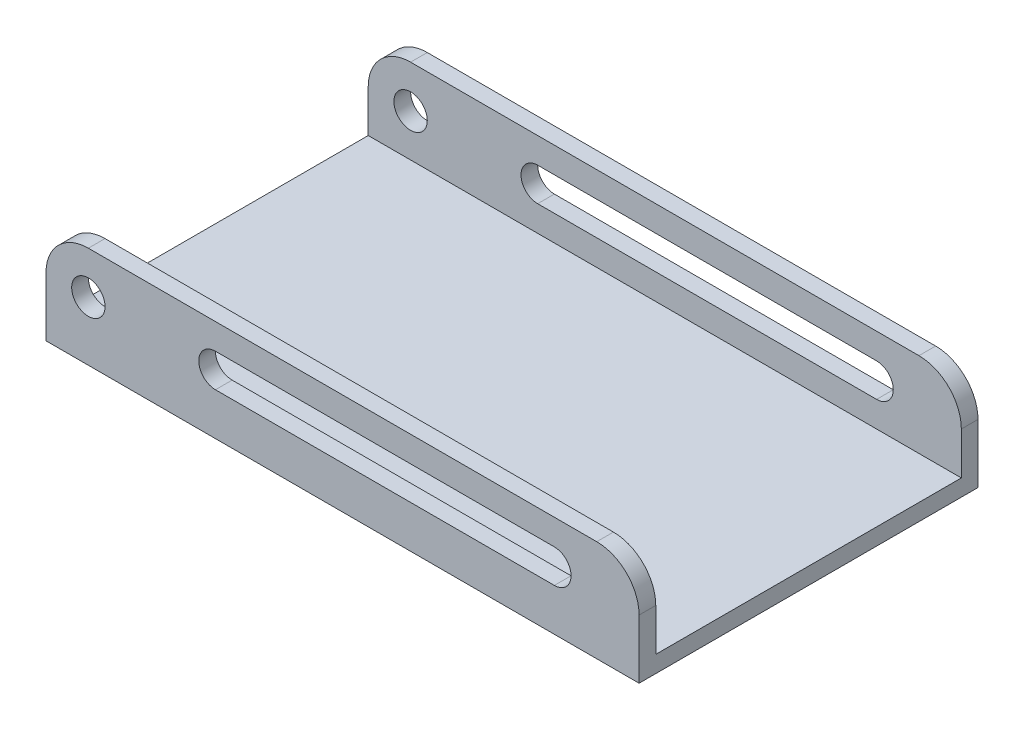
ISO-10303-21;
HEADER;
FILE_DESCRIPTION(('STEP AP214'),'2;1');
FILE_NAME('part.step','',(''),(''),'','','');
FILE_SCHEMA(('AUTOMOTIVE_DESIGN { 1 0 10303 214 1 1 1 1 }'));
ENDSEC;
DATA;
#1=APPLICATION_CONTEXT('core data for automotive mechanical design processes');
#2=APPLICATION_PROTOCOL_DEFINITION('international standard','automotive_design',2000,#1);
#3=PRODUCT_CONTEXT('',#1,'mechanical');
#4=PRODUCT('Part','Part','',(#3));
#5=PRODUCT_RELATED_PRODUCT_CATEGORY('part','',(#4));
#6=PRODUCT_DEFINITION_FORMATION('','',#4);
#7=PRODUCT_DEFINITION_CONTEXT('part definition',#1,'design');
#8=PRODUCT_DEFINITION('design','',#6,#7);
#9=PRODUCT_DEFINITION_SHAPE('','',#8);
#10=(LENGTH_UNIT() NAMED_UNIT(*) SI_UNIT(.MILLI.,.METRE.));
#11=(NAMED_UNIT(*) PLANE_ANGLE_UNIT() SI_UNIT($,.RADIAN.));
#12=(NAMED_UNIT(*) SI_UNIT($,.STERADIAN.) SOLID_ANGLE_UNIT());
#13=UNCERTAINTY_MEASURE_WITH_UNIT(LENGTH_MEASURE(1.E-05),#10,'distance_accuracy_value','');
#14=(GEOMETRIC_REPRESENTATION_CONTEXT(3) GLOBAL_UNCERTAINTY_ASSIGNED_CONTEXT((#13)) GLOBAL_UNIT_ASSIGNED_CONTEXT((#10,
#11,#12)) REPRESENTATION_CONTEXT('',''));
#15=CARTESIAN_POINT('',(0.,0.,0.));
#16=DIRECTION('',(0.,0.,1.));
#17=DIRECTION('',(1.,0.,0.));
#18=AXIS2_PLACEMENT_3D('',#15,#16,#17);
#19=CARTESIAN_POINT('',(0.,5.,0.));
#20=DIRECTION('',(0.,-1.,0.));
#21=DIRECTION('',(0.,0.,-1.));
#22=AXIS2_PLACEMENT_3D('',#19,#20,#21);
#23=PLANE('',#22);
#24=DIRECTION('',(1.,0.,0.));
#25=VECTOR('',#24,1.);
#26=CARTESIAN_POINT('',(0.,5.,-96.6));
#27=LINE('',#26,#25);
#28=CARTESIAN_POINT('',(0.,5.,-96.6));
#29=VERTEX_POINT('',#28);
#30=CARTESIAN_POINT('',(177.8,5.,-96.6));
#31=VERTEX_POINT('',#30);
#32=EDGE_CURVE('E245',#29,#31,#27,.T.);
#33=ORIENTED_EDGE('',*,*,#32,.F.);
#34=DIRECTION('',(0.,0.,1.));
#35=VECTOR('',#34,1.);
#36=CARTESIAN_POINT('',(0.,5.,0.));
#37=LINE('',#36,#35);
#38=CARTESIAN_POINT('',(0.,5.,-5.));
#39=VERTEX_POINT('',#38);
#40=EDGE_CURVE('E272',#29,#39,#37,.T.);
#41=ORIENTED_EDGE('',*,*,#40,.T.);
#42=DIRECTION('',(-1.,0.,0.));
#43=VECTOR('',#42,1.);
#44=CARTESIAN_POINT('',(0.,5.,-5.));
#45=LINE('',#44,#43);
#46=CARTESIAN_POINT('',(177.8,5.,-5.));
#47=VERTEX_POINT('',#46);
#48=EDGE_CURVE('E258',#47,#39,#45,.T.);
#49=ORIENTED_EDGE('',*,*,#48,.F.);
#50=DIRECTION('',(0.,0.,-1.));
#51=VECTOR('',#50,1.);
#52=CARTESIAN_POINT('',(177.8,5.,0.));
#53=LINE('',#52,#51);
#54=EDGE_CURVE('E275',#47,#31,#53,.T.);
#55=ORIENTED_EDGE('',*,*,#54,.T.);
#56=EDGE_LOOP('',(#33,#41,#49,#55));
#57=FACE_BOUND('',#56,.T.);
#58=ADVANCED_FACE('F37',(#57),#23,.F.);
#59=CARTESIAN_POINT('',(0.,5.,0.));
#60=DIRECTION('',(1.,0.,0.));
#61=DIRECTION('',(0.,0.,-1.));
#62=AXIS2_PLACEMENT_3D('',#59,#60,#61);
#63=PLANE('',#62);
#64=DIRECTION('',(0.,-1.,0.));
#65=VECTOR('',#64,1.);
#66=CARTESIAN_POINT('',(0.,30.4,-96.6));
#67=LINE('',#66,#65);
#68=CARTESIAN_POINT('',(0.,17.7,-96.6));
#69=VERTEX_POINT('',#68);
#70=EDGE_CURVE('E256',#69,#29,#67,.T.);
#71=ORIENTED_EDGE('',*,*,#70,.F.);
#72=DIRECTION('',(0.,0.,1.));
#73=VECTOR('',#72,1.);
#74=CARTESIAN_POINT('',(0.,17.7,-101.6));
#75=LINE('',#74,#73);
#76=CARTESIAN_POINT('',(0.,17.7,-101.6));
#77=VERTEX_POINT('',#76);
#78=EDGE_CURVE('E320',#69,#77,#75,.F.);
#79=ORIENTED_EDGE('',*,*,#78,.T.);
#80=DIRECTION('',(0.,-1.,0.));
#81=VECTOR('',#80,1.);
#82=CARTESIAN_POINT('',(0.,5.,-101.6));
#83=LINE('',#82,#81);
#84=CARTESIAN_POINT('',(0.,0.,-101.6));
#85=VERTEX_POINT('',#84);
#86=EDGE_CURVE('E279',#77,#85,#83,.T.);
#87=ORIENTED_EDGE('',*,*,#86,.T.);
#88=DIRECTION('',(0.,0.,1.));
#89=VECTOR('',#88,1.);
#90=CARTESIAN_POINT('',(0.,0.,0.));
#91=LINE('',#90,#89);
#92=CARTESIAN_POINT('',(0.,0.,0.));
#93=VERTEX_POINT('',#92);
#94=EDGE_CURVE('E271',#85,#93,#91,.T.);
#95=ORIENTED_EDGE('',*,*,#94,.T.);
#96=DIRECTION('',(0.,-1.,0.));
#97=VECTOR('',#96,1.);
#98=CARTESIAN_POINT('',(0.,5.,0.));
#99=LINE('',#98,#97);
#100=CARTESIAN_POINT('',(0.,17.7,0.));
#101=VERTEX_POINT('',#100);
#102=EDGE_CURVE('E295',#101,#93,#99,.T.);
#103=ORIENTED_EDGE('',*,*,#102,.F.);
#104=DIRECTION('',(0.,0.,1.));
#105=VECTOR('',#104,1.);
#106=CARTESIAN_POINT('',(0.,17.7,0.));
#107=LINE('',#106,#105);
#108=CARTESIAN_POINT('',(0.,17.7,-5.));
#109=VERTEX_POINT('',#108);
#110=EDGE_CURVE('E318',#101,#109,#107,.F.);
#111=ORIENTED_EDGE('',*,*,#110,.T.);
#112=DIRECTION('',(0.,-1.,0.));
#113=VECTOR('',#112,1.);
#114=CARTESIAN_POINT('',(0.,30.4,-5.));
#115=LINE('',#114,#113);
#116=EDGE_CURVE('E265',#109,#39,#115,.T.);
#117=ORIENTED_EDGE('',*,*,#116,.T.);
#118=ORIENTED_EDGE('',*,*,#40,.F.);
#119=EDGE_LOOP('',(#71,#79,#87,#95,#103,#111,#117,#118));
#120=FACE_BOUND('',#119,.T.);
#121=ADVANCED_FACE('F355',(#120),#63,.F.);
#122=CARTESIAN_POINT('',(0.,5.,0.));
#123=DIRECTION('',(0.,0.,-1.));
#124=DIRECTION('',(-1.,0.,0.));
#125=AXIS2_PLACEMENT_3D('',#122,#123,#124);
#126=PLANE('',#125);
#127=DIRECTION('',(1.,0.,0.));
#128=VECTOR('',#127,1.);
#129=CARTESIAN_POINT('',(50.8,12.7,0.));
#130=LINE('',#129,#128);
#131=CARTESIAN_POINT('',(50.8,12.7,0.));
#132=VERTEX_POINT('',#131);
#133=CARTESIAN_POINT('',(152.4,12.7,0.));
#134=VERTEX_POINT('',#133);
#135=EDGE_CURVE('E210',#132,#134,#130,.T.);
#136=ORIENTED_EDGE('',*,*,#135,.F.);
#137=CARTESIAN_POINT('',(50.8,17.7,0.));
#138=DIRECTION('',(0.,0.,1.));
#139=DIRECTION('',(1.,0.,0.));
#140=AXIS2_PLACEMENT_3D('',#137,#138,#139);
#141=CIRCLE('',#140,5.);
#142=CARTESIAN_POINT('',(50.8,22.7,0.));
#143=VERTEX_POINT('',#142);
#144=EDGE_CURVE('E208',#143,#132,#141,.T.);
#145=ORIENTED_EDGE('',*,*,#144,.F.);
#146=DIRECTION('',(-1.,0.,0.));
#147=VECTOR('',#146,1.);
#148=CARTESIAN_POINT('',(50.8,22.7,0.));
#149=LINE('',#148,#147);
#150=CARTESIAN_POINT('',(152.4,22.7,0.));
#151=VERTEX_POINT('',#150);
#152=EDGE_CURVE('E200',#151,#143,#149,.T.);
#153=ORIENTED_EDGE('',*,*,#152,.F.);
#154=CARTESIAN_POINT('',(152.4,17.7,0.));
#155=DIRECTION('',(0.,0.,1.));
#156=DIRECTION('',(1.,0.,0.));
#157=AXIS2_PLACEMENT_3D('',#154,#155,#156);
#158=CIRCLE('',#157,5.);
#159=EDGE_CURVE('E203',#134,#151,#158,.T.);
#160=ORIENTED_EDGE('',*,*,#159,.F.);
#161=EDGE_LOOP('',(#136,#145,#153,#160));
#162=FACE_BOUND('',#161,.T.);
#163=CARTESIAN_POINT('',(12.7,17.7,0.));
#164=DIRECTION('',(0.,0.,1.));
#165=DIRECTION('',(1.,0.,0.));
#166=AXIS2_PLACEMENT_3D('',#163,#164,#165);
#167=CIRCLE('',#166,5.);
#168=CARTESIAN_POINT('',(17.7,17.7,0.));
#169=VERTEX_POINT('',#168);
#170=EDGE_CURVE('E227',#169,#169,#167,.T.);
#171=ORIENTED_EDGE('',*,*,#170,.F.);
#172=EDGE_LOOP('',(#171));
#173=FACE_BOUND('',#172,.T.);
#174=DIRECTION('',(1.,0.,0.));
#175=VECTOR('',#174,1.);
#176=CARTESIAN_POINT('',(0.,30.4,0.));
#177=LINE('',#176,#175);
#178=CARTESIAN_POINT('',(12.7,30.4,0.));
#179=VERTEX_POINT('',#178);
#180=CARTESIAN_POINT('',(165.1,30.4,0.));
#181=VERTEX_POINT('',#180);
#182=EDGE_CURVE('E259',#179,#181,#177,.T.);
#183=ORIENTED_EDGE('',*,*,#182,.F.);
#184=CARTESIAN_POINT('',(12.7,17.7,0.));
#185=DIRECTION('',(0.,0.,-1.));
#186=DIRECTION('',(-1.,0.,0.));
#187=AXIS2_PLACEMENT_3D('',#184,#185,#186);
#188=CIRCLE('',#187,12.7);
#189=EDGE_CURVE('E334',#179,#101,#188,.F.);
#190=ORIENTED_EDGE('',*,*,#189,.T.);
#191=ORIENTED_EDGE('',*,*,#102,.T.);
#192=DIRECTION('',(1.,0.,0.));
#193=VECTOR('',#192,1.);
#194=CARTESIAN_POINT('',(0.,0.,0.));
#195=LINE('',#194,#193);
#196=CARTESIAN_POINT('',(177.8,0.,0.));
#197=VERTEX_POINT('',#196);
#198=EDGE_CURVE('E282',#93,#197,#195,.T.);
#199=ORIENTED_EDGE('',*,*,#198,.T.);
#200=DIRECTION('',(0.,-1.,0.));
#201=VECTOR('',#200,1.);
#202=CARTESIAN_POINT('',(177.8,5.,0.));
#203=LINE('',#202,#201);
#204=CARTESIAN_POINT('',(177.8,17.7,0.));
#205=VERTEX_POINT('',#204);
#206=EDGE_CURVE('E293',#205,#197,#203,.T.);
#207=ORIENTED_EDGE('',*,*,#206,.F.);
#208=CARTESIAN_POINT('',(165.1,17.7,0.));
#209=DIRECTION('',(0.,0.,-1.));
#210=DIRECTION('',(-1.,0.,0.));
#211=AXIS2_PLACEMENT_3D('',#208,#209,#210);
#212=CIRCLE('',#211,12.7);
#213=EDGE_CURVE('E332',#205,#181,#212,.F.);
#214=ORIENTED_EDGE('',*,*,#213,.T.);
#215=EDGE_LOOP('',(#183,#190,#191,#199,#207,#214));
#216=FACE_BOUND('',#215,.T.);
#217=ADVANCED_FACE('F351',(#162,#173,#216),#126,.F.);
#218=CARTESIAN_POINT('',(177.8,5.,0.));
#219=DIRECTION('',(-1.,0.,0.));
#220=DIRECTION('',(0.,0.,1.));
#221=AXIS2_PLACEMENT_3D('',#218,#219,#220);
#222=PLANE('',#221);
#223=DIRECTION('',(0.,-1.,0.));
#224=VECTOR('',#223,1.);
#225=CARTESIAN_POINT('',(177.8,5.,-101.6));
#226=LINE('',#225,#224);
#227=CARTESIAN_POINT('',(177.8,17.7,-101.6));
#228=VERTEX_POINT('',#227);
#229=CARTESIAN_POINT('',(177.8,0.,-101.6));
#230=VERTEX_POINT('',#229);
#231=EDGE_CURVE('E291',#228,#230,#226,.T.);
#232=ORIENTED_EDGE('',*,*,#231,.F.);
#233=DIRECTION('',(0.,0.,-1.));
#234=VECTOR('',#233,1.);
#235=CARTESIAN_POINT('',(177.8,17.7,-96.6));
#236=LINE('',#235,#234);
#237=CARTESIAN_POINT('',(177.8,17.7,-96.6));
#238=VERTEX_POINT('',#237);
#239=EDGE_CURVE('E11',#228,#238,#236,.F.);
#240=ORIENTED_EDGE('',*,*,#239,.T.);
#241=DIRECTION('',(0.,-1.,0.));
#242=VECTOR('',#241,1.);
#243=CARTESIAN_POINT('',(177.8,30.4,-96.6));
#244=LINE('',#243,#242);
#245=EDGE_CURVE('E252',#238,#31,#244,.T.);
#246=ORIENTED_EDGE('',*,*,#245,.T.);
#247=ORIENTED_EDGE('',*,*,#54,.F.);
#248=DIRECTION('',(0.,-1.,0.));
#249=VECTOR('',#248,1.);
#250=CARTESIAN_POINT('',(177.8,30.4,-5.));
#251=LINE('',#250,#249);
#252=CARTESIAN_POINT('',(177.8,17.7,-5.));
#253=VERTEX_POINT('',#252);
#254=EDGE_CURVE('E269',#253,#47,#251,.T.);
#255=ORIENTED_EDGE('',*,*,#254,.F.);
#256=DIRECTION('',(0.,0.,-1.));
#257=VECTOR('',#256,1.);
#258=CARTESIAN_POINT('',(177.8,17.7,0.));
#259=LINE('',#258,#257);
#260=EDGE_CURVE('E45',#253,#205,#259,.F.);
#261=ORIENTED_EDGE('',*,*,#260,.T.);
#262=ORIENTED_EDGE('',*,*,#206,.T.);
#263=DIRECTION('',(0.,0.,-1.));
#264=VECTOR('',#263,1.);
#265=CARTESIAN_POINT('',(177.8,0.,0.));
#266=LINE('',#265,#264);
#267=EDGE_CURVE('E285',#197,#230,#266,.T.);
#268=ORIENTED_EDGE('',*,*,#267,.T.);
#269=EDGE_LOOP('',(#232,#240,#246,#247,#255,#261,#262,#268));
#270=FACE_BOUND('',#269,.T.);
#271=ADVANCED_FACE('F385',(#270),#222,.F.);
#272=CARTESIAN_POINT('',(0.,5.,-101.6));
#273=DIRECTION('',(0.,0.,1.));
#274=DIRECTION('',(1.,0.,0.));
#275=AXIS2_PLACEMENT_3D('',#272,#273,#274);
#276=PLANE('',#275);
#277=DIRECTION('',(-1.,0.,0.));
#278=VECTOR('',#277,1.);
#279=CARTESIAN_POINT('',(50.8,22.7,-101.6));
#280=LINE('',#279,#278);
#281=CARTESIAN_POINT('',(152.4,22.7,-101.6));
#282=VERTEX_POINT('',#281);
#283=CARTESIAN_POINT('',(50.8,22.7,-101.6));
#284=VERTEX_POINT('',#283);
#285=EDGE_CURVE('E199',#282,#284,#280,.T.);
#286=ORIENTED_EDGE('',*,*,#285,.T.);
#287=CARTESIAN_POINT('',(50.8,17.7,-101.6));
#288=DIRECTION('',(0.,0.,1.));
#289=DIRECTION('',(1.,0.,0.));
#290=AXIS2_PLACEMENT_3D('',#287,#288,#289);
#291=CIRCLE('',#290,5.);
#292=CARTESIAN_POINT('',(50.8,12.7,-101.6));
#293=VERTEX_POINT('',#292);
#294=EDGE_CURVE('E177',#284,#293,#291,.T.);
#295=ORIENTED_EDGE('',*,*,#294,.T.);
#296=DIRECTION('',(1.,0.,0.));
#297=VECTOR('',#296,1.);
#298=CARTESIAN_POINT('',(50.8,12.7,-101.6));
#299=LINE('',#298,#297);
#300=CARTESIAN_POINT('',(152.4,12.7,-101.6));
#301=VERTEX_POINT('',#300);
#302=EDGE_CURVE('E188',#293,#301,#299,.T.);
#303=ORIENTED_EDGE('',*,*,#302,.T.);
#304=CARTESIAN_POINT('',(152.4,17.7,-101.6));
#305=DIRECTION('',(0.,0.,1.));
#306=DIRECTION('',(1.,0.,0.));
#307=AXIS2_PLACEMENT_3D('',#304,#305,#306);
#308=CIRCLE('',#307,5.);
#309=EDGE_CURVE('E194',#301,#282,#308,.T.);
#310=ORIENTED_EDGE('',*,*,#309,.T.);
#311=EDGE_LOOP('',(#286,#295,#303,#310));
#312=FACE_BOUND('',#311,.T.);
#313=CARTESIAN_POINT('',(12.7,17.7,-101.6));
#314=DIRECTION('',(0.,0.,1.));
#315=DIRECTION('',(1.,0.,0.));
#316=AXIS2_PLACEMENT_3D('',#313,#314,#315);
#317=CIRCLE('',#316,5.);
#318=CARTESIAN_POINT('',(17.7,17.7,-101.6));
#319=VERTEX_POINT('',#318);
#320=EDGE_CURVE('E211',#319,#319,#317,.T.);
#321=ORIENTED_EDGE('',*,*,#320,.T.);
#322=EDGE_LOOP('',(#321));
#323=FACE_BOUND('',#322,.T.);
#324=ORIENTED_EDGE('',*,*,#86,.F.);
#325=CARTESIAN_POINT('',(12.7,17.7,-101.6));
#326=DIRECTION('',(0.,0.,1.));
#327=DIRECTION('',(1.,0.,0.));
#328=AXIS2_PLACEMENT_3D('',#325,#326,#327);
#329=CIRCLE('',#328,12.7);
#330=CARTESIAN_POINT('',(12.7,30.4,-101.6));
#331=VERTEX_POINT('',#330);
#332=EDGE_CURVE('E324',#77,#331,#329,.F.);
#333=ORIENTED_EDGE('',*,*,#332,.T.);
#334=DIRECTION('',(-1.,0.,0.));
#335=VECTOR('',#334,1.);
#336=CARTESIAN_POINT('',(0.,30.4,-101.6));
#337=LINE('',#336,#335);
#338=CARTESIAN_POINT('',(165.1,30.4,-101.6));
#339=VERTEX_POINT('',#338);
#340=EDGE_CURVE('E249',#339,#331,#337,.T.);
#341=ORIENTED_EDGE('',*,*,#340,.F.);
#342=CARTESIAN_POINT('',(165.1,17.7,-101.6));
#343=DIRECTION('',(0.,0.,1.));
#344=DIRECTION('',(1.,0.,0.));
#345=AXIS2_PLACEMENT_3D('',#342,#343,#344);
#346=CIRCLE('',#345,12.7);
#347=EDGE_CURVE('E322',#339,#228,#346,.F.);
#348=ORIENTED_EDGE('',*,*,#347,.T.);
#349=ORIENTED_EDGE('',*,*,#231,.T.);
#350=DIRECTION('',(-1.,0.,0.));
#351=VECTOR('',#350,1.);
#352=CARTESIAN_POINT('',(0.,0.,-101.6));
#353=LINE('',#352,#351);
#354=EDGE_CURVE('E276',#230,#85,#353,.T.);
#355=ORIENTED_EDGE('',*,*,#354,.T.);
#356=EDGE_LOOP('',(#324,#333,#341,#348,#349,#355));
#357=FACE_BOUND('',#356,.T.);
#358=ADVANCED_FACE('F196',(#312,#323,#357),#276,.F.);
#359=CARTESIAN_POINT('',(0.,0.,0.));
#360=DIRECTION('',(0.,-1.,0.));
#361=DIRECTION('',(0.,0.,-1.));
#362=AXIS2_PLACEMENT_3D('',#359,#360,#361);
#363=PLANE('',#362);
#364=ORIENTED_EDGE('',*,*,#94,.F.);
#365=ORIENTED_EDGE('',*,*,#354,.F.);
#366=ORIENTED_EDGE('',*,*,#267,.F.);
#367=ORIENTED_EDGE('',*,*,#198,.F.);
#368=EDGE_LOOP('',(#364,#365,#366,#367));
#369=FACE_BOUND('',#368,.T.);
#370=ADVANCED_FACE('F360',(#369),#363,.T.);
#371=CARTESIAN_POINT('',(0.,30.4,-5.));
#372=DIRECTION('',(0.,0.,1.));
#373=DIRECTION('',(1.,0.,0.));
#374=AXIS2_PLACEMENT_3D('',#371,#372,#373);
#375=PLANE('',#374);
#376=DIRECTION('',(-1.,0.,0.));
#377=VECTOR('',#376,1.);
#378=CARTESIAN_POINT('',(0.,22.7,-5.));
#379=LINE('',#378,#377);
#380=CARTESIAN_POINT('',(152.4,22.7,-5.));
#381=VERTEX_POINT('',#380);
#382=CARTESIAN_POINT('',(50.8,22.7,-5.));
#383=VERTEX_POINT('',#382);
#384=EDGE_CURVE('E239',#381,#383,#379,.T.);
#385=ORIENTED_EDGE('',*,*,#384,.T.);
#386=CARTESIAN_POINT('',(50.8,17.7,-5.));
#387=DIRECTION('',(0.,0.,1.));
#388=DIRECTION('',(1.,0.,0.));
#389=AXIS2_PLACEMENT_3D('',#386,#387,#388);
#390=CIRCLE('',#389,5.);
#391=CARTESIAN_POINT('',(50.8,12.7,-5.));
#392=VERTEX_POINT('',#391);
#393=EDGE_CURVE('E242',#383,#392,#390,.T.);
#394=ORIENTED_EDGE('',*,*,#393,.T.);
#395=DIRECTION('',(1.,0.,0.));
#396=VECTOR('',#395,1.);
#397=CARTESIAN_POINT('',(0.,12.7,-5.));
#398=LINE('',#397,#396);
#399=CARTESIAN_POINT('',(152.4,12.7,-5.));
#400=VERTEX_POINT('',#399);
#401=EDGE_CURVE('E233',#392,#400,#398,.T.);
#402=ORIENTED_EDGE('',*,*,#401,.T.);
#403=CARTESIAN_POINT('',(152.4,17.7,-5.));
#404=DIRECTION('',(0.,0.,1.));
#405=DIRECTION('',(1.,0.,0.));
#406=AXIS2_PLACEMENT_3D('',#403,#404,#405);
#407=CIRCLE('',#406,5.);
#408=EDGE_CURVE('E236',#400,#381,#407,.T.);
#409=ORIENTED_EDGE('',*,*,#408,.T.);
#410=EDGE_LOOP('',(#385,#394,#402,#409));
#411=FACE_BOUND('',#410,.T.);
#412=CARTESIAN_POINT('',(12.7,17.7,-5.));
#413=DIRECTION('',(0.,0.,1.));
#414=DIRECTION('',(1.,0.,0.));
#415=AXIS2_PLACEMENT_3D('',#412,#413,#414);
#416=CIRCLE('',#415,5.);
#417=CARTESIAN_POINT('',(17.7,17.7,-5.));
#418=VERTEX_POINT('',#417);
#419=EDGE_CURVE('E230',#418,#418,#416,.T.);
#420=ORIENTED_EDGE('',*,*,#419,.T.);
#421=EDGE_LOOP('',(#420));
#422=FACE_BOUND('',#421,.T.);
#423=ORIENTED_EDGE('',*,*,#116,.F.);
#424=CARTESIAN_POINT('',(12.7,17.7,-5.));
#425=DIRECTION('',(0.,0.,1.));
#426=DIRECTION('',(1.,0.,0.));
#427=AXIS2_PLACEMENT_3D('',#424,#425,#426);
#428=CIRCLE('',#427,12.7);
#429=CARTESIAN_POINT('',(12.7,30.4,-5.));
#430=VERTEX_POINT('',#429);
#431=EDGE_CURVE('E337',#109,#430,#428,.F.);
#432=ORIENTED_EDGE('',*,*,#431,.T.);
#433=DIRECTION('',(-1.,0.,0.));
#434=VECTOR('',#433,1.);
#435=CARTESIAN_POINT('',(0.,30.4,-5.));
#436=LINE('',#435,#434);
#437=CARTESIAN_POINT('',(165.1,30.4,-5.));
#438=VERTEX_POINT('',#437);
#439=EDGE_CURVE('E262',#438,#430,#436,.T.);
#440=ORIENTED_EDGE('',*,*,#439,.F.);
#441=CARTESIAN_POINT('',(165.1,17.7,-5.));
#442=DIRECTION('',(0.,0.,1.));
#443=DIRECTION('',(1.,0.,0.));
#444=AXIS2_PLACEMENT_3D('',#441,#442,#443);
#445=CIRCLE('',#444,12.7);
#446=EDGE_CURVE('E52',#438,#253,#445,.F.);
#447=ORIENTED_EDGE('',*,*,#446,.T.);
#448=ORIENTED_EDGE('',*,*,#254,.T.);
#449=ORIENTED_EDGE('',*,*,#48,.T.);
#450=EDGE_LOOP('',(#423,#432,#440,#447,#448,#449));
#451=FACE_BOUND('',#450,.T.);
#452=ADVANCED_FACE('F340',(#411,#422,#451),#375,.F.);
#453=CARTESIAN_POINT('',(0.,30.4,0.));
#454=DIRECTION('',(0.,-1.,0.));
#455=DIRECTION('',(0.,0.,-1.));
#456=AXIS2_PLACEMENT_3D('',#453,#454,#455);
#457=PLANE('',#456);
#458=ORIENTED_EDGE('',*,*,#439,.T.);
#459=DIRECTION('',(0.,0.,1.));
#460=VECTOR('',#459,1.);
#461=CARTESIAN_POINT('',(12.7,30.4,0.));
#462=LINE('',#461,#460);
#463=EDGE_CURVE('E329',#430,#179,#462,.T.);
#464=ORIENTED_EDGE('',*,*,#463,.T.);
#465=ORIENTED_EDGE('',*,*,#182,.T.);
#466=DIRECTION('',(0.,0.,-1.));
#467=VECTOR('',#466,1.);
#468=CARTESIAN_POINT('',(165.1,30.4,0.));
#469=LINE('',#468,#467);
#470=EDGE_CURVE('E326',#181,#438,#469,.T.);
#471=ORIENTED_EDGE('',*,*,#470,.T.);
#472=EDGE_LOOP('',(#458,#464,#465,#471));
#473=FACE_BOUND('',#472,.T.);
#474=ADVANCED_FACE('F345',(#473),#457,.F.);
#475=CARTESIAN_POINT('',(0.,30.4,-96.6));
#476=DIRECTION('',(0.,0.,-1.));
#477=DIRECTION('',(-1.,0.,0.));
#478=AXIS2_PLACEMENT_3D('',#475,#476,#477);
#479=PLANE('',#478);
#480=DIRECTION('',(-1.,0.,0.));
#481=VECTOR('',#480,1.);
#482=CARTESIAN_POINT('',(0.,12.7,-96.6));
#483=LINE('',#482,#481);
#484=CARTESIAN_POINT('',(152.4,12.7,-96.6));
#485=VERTEX_POINT('',#484);
#486=CARTESIAN_POINT('',(50.8,12.7,-96.6));
#487=VERTEX_POINT('',#486);
#488=EDGE_CURVE('E297',#485,#487,#483,.T.);
#489=ORIENTED_EDGE('',*,*,#488,.T.);
#490=CARTESIAN_POINT('',(50.8,17.7,-96.6));
#491=DIRECTION('',(0.,0.,-1.));
#492=DIRECTION('',(-1.,0.,0.));
#493=AXIS2_PLACEMENT_3D('',#490,#491,#492);
#494=CIRCLE('',#493,5.);
#495=CARTESIAN_POINT('',(50.8,22.7,-96.6));
#496=VERTEX_POINT('',#495);
#497=EDGE_CURVE('E180',#487,#496,#494,.T.);
#498=ORIENTED_EDGE('',*,*,#497,.T.);
#499=DIRECTION('',(1.,0.,0.));
#500=VECTOR('',#499,1.);
#501=CARTESIAN_POINT('',(0.,22.7,-96.6));
#502=LINE('',#501,#500);
#503=CARTESIAN_POINT('',(152.4,22.7,-96.6));
#504=VERTEX_POINT('',#503);
#505=EDGE_CURVE('E304',#496,#504,#502,.T.);
#506=ORIENTED_EDGE('',*,*,#505,.T.);
#507=CARTESIAN_POINT('',(152.4,17.7,-96.6));
#508=DIRECTION('',(0.,0.,-1.));
#509=DIRECTION('',(-1.,0.,0.));
#510=AXIS2_PLACEMENT_3D('',#507,#508,#509);
#511=CIRCLE('',#510,5.);
#512=EDGE_CURVE('E301',#504,#485,#511,.T.);
#513=ORIENTED_EDGE('',*,*,#512,.T.);
#514=EDGE_LOOP('',(#489,#498,#506,#513));
#515=FACE_BOUND('',#514,.T.);
#516=CARTESIAN_POINT('',(12.7,17.7,-96.6));
#517=DIRECTION('',(0.,0.,-1.));
#518=DIRECTION('',(-1.,0.,0.));
#519=AXIS2_PLACEMENT_3D('',#516,#517,#518);
#520=CIRCLE('',#519,5.);
#521=CARTESIAN_POINT('',(7.69999999999999,17.7,-96.6));
#522=VERTEX_POINT('',#521);
#523=EDGE_CURVE('E218',#522,#522,#520,.T.);
#524=ORIENTED_EDGE('',*,*,#523,.T.);
#525=EDGE_LOOP('',(#524));
#526=FACE_BOUND('',#525,.T.);
#527=DIRECTION('',(1.,0.,0.));
#528=VECTOR('',#527,1.);
#529=CARTESIAN_POINT('',(0.,30.4,-96.6));
#530=LINE('',#529,#528);
#531=CARTESIAN_POINT('',(12.7,30.4,-96.6));
#532=VERTEX_POINT('',#531);
#533=CARTESIAN_POINT('',(165.1,30.4,-96.6));
#534=VERTEX_POINT('',#533);
#535=EDGE_CURVE('E246',#532,#534,#530,.T.);
#536=ORIENTED_EDGE('',*,*,#535,.F.);
#537=CARTESIAN_POINT('',(12.7,17.7,-96.6));
#538=DIRECTION('',(0.,0.,-1.));
#539=DIRECTION('',(-1.,0.,0.));
#540=AXIS2_PLACEMENT_3D('',#537,#538,#539);
#541=CIRCLE('',#540,12.7);
#542=EDGE_CURVE('E316',#532,#69,#541,.F.);
#543=ORIENTED_EDGE('',*,*,#542,.T.);
#544=ORIENTED_EDGE('',*,*,#70,.T.);
#545=ORIENTED_EDGE('',*,*,#32,.T.);
#546=ORIENTED_EDGE('',*,*,#245,.F.);
#547=CARTESIAN_POINT('',(165.1,17.7,-96.6));
#548=DIRECTION('',(0.,0.,-1.));
#549=DIRECTION('',(-1.,0.,0.));
#550=AXIS2_PLACEMENT_3D('',#547,#548,#549);
#551=CIRCLE('',#550,12.7);
#552=EDGE_CURVE('E314',#238,#534,#551,.F.);
#553=ORIENTED_EDGE('',*,*,#552,.T.);
#554=EDGE_LOOP('',(#536,#543,#544,#545,#546,#553));
#555=FACE_BOUND('',#554,.T.);
#556=ADVANCED_FACE('F507',(#515,#526,#555),#479,.F.);
#557=CARTESIAN_POINT('',(0.,30.4,0.));
#558=DIRECTION('',(0.,1.,0.));
#559=DIRECTION('',(0.,0.,1.));
#560=AXIS2_PLACEMENT_3D('',#557,#558,#559);
#561=PLANE('',#560);
#562=ORIENTED_EDGE('',*,*,#340,.T.);
#563=DIRECTION('',(0.,0.,1.));
#564=VECTOR('',#563,1.);
#565=CARTESIAN_POINT('',(12.7,30.4,-96.6));
#566=LINE('',#565,#564);
#567=EDGE_CURVE('E311',#331,#532,#566,.T.);
#568=ORIENTED_EDGE('',*,*,#567,.T.);
#569=ORIENTED_EDGE('',*,*,#535,.T.);
#570=DIRECTION('',(0.,0.,-1.));
#571=VECTOR('',#570,1.);
#572=CARTESIAN_POINT('',(165.1,30.4,-101.6));
#573=LINE('',#572,#571);
#574=EDGE_CURVE('E308',#534,#339,#573,.T.);
#575=ORIENTED_EDGE('',*,*,#574,.T.);
#576=EDGE_LOOP('',(#562,#568,#569,#575));
#577=FACE_BOUND('',#576,.T.);
#578=ADVANCED_FACE('F500',(#577),#561,.T.);
#579=CARTESIAN_POINT('',(12.7,17.7,-101.6));
#580=DIRECTION('',(0.,0.,1.));
#581=DIRECTION('',(1.,0.,0.));
#582=AXIS2_PLACEMENT_3D('',#579,#580,#581);
#583=CYLINDRICAL_SURFACE('',#582,5.);
#584=ORIENTED_EDGE('',*,*,#320,.F.);
#585=EDGE_LOOP('',(#584));
#586=FACE_BOUND('',#585,.T.);
#587=ORIENTED_EDGE('',*,*,#523,.F.);
#588=EDGE_LOOP('',(#587));
#589=FACE_BOUND('',#588,.T.);
#590=ADVANCED_FACE('F467',(#586,#589),#583,.F.);
#591=CARTESIAN_POINT('',(50.8,12.7,-101.6));
#592=DIRECTION('',(0.,-1.,0.));
#593=DIRECTION('',(0.,0.,-1.));
#594=AXIS2_PLACEMENT_3D('',#591,#592,#593);
#595=PLANE('',#594);
#596=DIRECTION('',(0.,0.,1.));
#597=VECTOR('',#596,1.);
#598=CARTESIAN_POINT('',(152.4,12.7,-101.6));
#599=LINE('',#598,#597);
#600=EDGE_CURVE('E191',#301,#485,#599,.T.);
#601=ORIENTED_EDGE('',*,*,#600,.F.);
#602=ORIENTED_EDGE('',*,*,#302,.F.);
#603=DIRECTION('',(0.,0.,1.));
#604=VECTOR('',#603,1.);
#605=CARTESIAN_POINT('',(50.8,12.7,-101.6));
#606=LINE('',#605,#604);
#607=EDGE_CURVE('E172',#293,#487,#606,.T.);
#608=ORIENTED_EDGE('',*,*,#607,.T.);
#609=ORIENTED_EDGE('',*,*,#488,.F.);
#610=EDGE_LOOP('',(#601,#602,#608,#609));
#611=FACE_BOUND('',#610,.T.);
#612=ADVANCED_FACE('F189',(#611),#595,.F.);
#613=CARTESIAN_POINT('',(152.4,17.7,-101.6));
#614=DIRECTION('',(0.,0.,1.));
#615=DIRECTION('',(1.,0.,0.));
#616=AXIS2_PLACEMENT_3D('',#613,#614,#615);
#617=CYLINDRICAL_SURFACE('',#616,5.);
#618=DIRECTION('',(0.,0.,1.));
#619=VECTOR('',#618,1.);
#620=CARTESIAN_POINT('',(152.4,22.7,-101.6));
#621=LINE('',#620,#619);
#622=EDGE_CURVE('E220',#282,#504,#621,.T.);
#623=ORIENTED_EDGE('',*,*,#622,.F.);
#624=ORIENTED_EDGE('',*,*,#309,.F.);
#625=ORIENTED_EDGE('',*,*,#600,.T.);
#626=ORIENTED_EDGE('',*,*,#512,.F.);
#627=EDGE_LOOP('',(#623,#624,#625,#626));
#628=FACE_BOUND('',#627,.T.);
#629=ADVANCED_FACE('F439',(#628),#617,.F.);
#630=CARTESIAN_POINT('',(50.8,22.7,-101.6));
#631=DIRECTION('',(0.,1.,0.));
#632=DIRECTION('',(0.,0.,1.));
#633=AXIS2_PLACEMENT_3D('',#630,#631,#632);
#634=PLANE('',#633);
#635=DIRECTION('',(0.,0.,1.));
#636=VECTOR('',#635,1.);
#637=CARTESIAN_POINT('',(50.8,22.7,-101.6));
#638=LINE('',#637,#636);
#639=EDGE_CURVE('E216',#284,#496,#638,.T.);
#640=ORIENTED_EDGE('',*,*,#639,.F.);
#641=ORIENTED_EDGE('',*,*,#285,.F.);
#642=ORIENTED_EDGE('',*,*,#622,.T.);
#643=ORIENTED_EDGE('',*,*,#505,.F.);
#644=EDGE_LOOP('',(#640,#641,#642,#643));
#645=FACE_BOUND('',#644,.T.);
#646=ADVANCED_FACE('F449',(#645),#634,.F.);
#647=CARTESIAN_POINT('',(50.8,17.7,-101.6));
#648=DIRECTION('',(0.,0.,1.));
#649=DIRECTION('',(1.,0.,0.));
#650=AXIS2_PLACEMENT_3D('',#647,#648,#649);
#651=CYLINDRICAL_SURFACE('',#650,5.);
#652=ORIENTED_EDGE('',*,*,#607,.F.);
#653=ORIENTED_EDGE('',*,*,#294,.F.);
#654=ORIENTED_EDGE('',*,*,#639,.T.);
#655=ORIENTED_EDGE('',*,*,#497,.F.);
#656=EDGE_LOOP('',(#652,#653,#654,#655));
#657=FACE_BOUND('',#656,.T.);
#658=ADVANCED_FACE('F174',(#657),#651,.F.);
#659=ORIENTED_EDGE('',*,*,#170,.T.);
#660=EDGE_LOOP('',(#659));
#661=FACE_BOUND('',#660,.T.);
#662=ORIENTED_EDGE('',*,*,#419,.F.);
#663=EDGE_LOOP('',(#662));
#664=FACE_BOUND('',#663,.T.);
#665=ADVANCED_FACE('F456',(#661,#664),#583,.F.);
#666=EDGE_CURVE('E219',#383,#143,#638,.T.);
#667=ORIENTED_EDGE('',*,*,#666,.T.);
#668=ORIENTED_EDGE('',*,*,#144,.T.);
#669=EDGE_CURVE('E184',#392,#132,#606,.T.);
#670=ORIENTED_EDGE('',*,*,#669,.F.);
#671=ORIENTED_EDGE('',*,*,#393,.F.);
#672=EDGE_LOOP('',(#667,#668,#670,#671));
#673=FACE_BOUND('',#672,.T.);
#674=ADVANCED_FACE('F446',(#673),#651,.F.);
#675=EDGE_CURVE('E223',#381,#151,#621,.T.);
#676=ORIENTED_EDGE('',*,*,#675,.T.);
#677=ORIENTED_EDGE('',*,*,#152,.T.);
#678=ORIENTED_EDGE('',*,*,#666,.F.);
#679=ORIENTED_EDGE('',*,*,#384,.F.);
#680=EDGE_LOOP('',(#676,#677,#678,#679));
#681=FACE_BOUND('',#680,.T.);
#682=ADVANCED_FACE('F436',(#681),#634,.F.);
#683=EDGE_CURVE('E183',#400,#134,#599,.T.);
#684=ORIENTED_EDGE('',*,*,#683,.T.);
#685=ORIENTED_EDGE('',*,*,#159,.T.);
#686=ORIENTED_EDGE('',*,*,#675,.F.);
#687=ORIENTED_EDGE('',*,*,#408,.F.);
#688=EDGE_LOOP('',(#684,#685,#686,#687));
#689=FACE_BOUND('',#688,.T.);
#690=ADVANCED_FACE('F426',(#689),#617,.F.);
#691=ORIENTED_EDGE('',*,*,#669,.T.);
#692=ORIENTED_EDGE('',*,*,#135,.T.);
#693=ORIENTED_EDGE('',*,*,#683,.F.);
#694=ORIENTED_EDGE('',*,*,#401,.F.);
#695=EDGE_LOOP('',(#691,#692,#693,#694));
#696=FACE_BOUND('',#695,.T.);
#697=ADVANCED_FACE('F394',(#696),#595,.F.);
#698=CARTESIAN_POINT('',(12.7,17.7,0.));
#699=DIRECTION('',(0.,0.,-1.));
#700=DIRECTION('',(-1.,0.,0.));
#701=AXIS2_PLACEMENT_3D('',#698,#699,#700);
#702=CYLINDRICAL_SURFACE('',#701,12.7);
#703=ORIENTED_EDGE('',*,*,#332,.F.);
#704=ORIENTED_EDGE('',*,*,#78,.F.);
#705=ORIENTED_EDGE('',*,*,#542,.F.);
#706=ORIENTED_EDGE('',*,*,#567,.F.);
#707=EDGE_LOOP('',(#703,#704,#705,#706));
#708=FACE_BOUND('',#707,.T.);
#709=ADVANCED_FACE('F391',(#708),#702,.T.);
#710=CARTESIAN_POINT('',(12.7,17.7,0.));
#711=DIRECTION('',(0.,0.,1.));
#712=DIRECTION('',(1.,0.,0.));
#713=AXIS2_PLACEMENT_3D('',#710,#711,#712);
#714=CYLINDRICAL_SURFACE('',#713,12.7);
#715=ORIENTED_EDGE('',*,*,#431,.F.);
#716=ORIENTED_EDGE('',*,*,#110,.F.);
#717=ORIENTED_EDGE('',*,*,#189,.F.);
#718=ORIENTED_EDGE('',*,*,#463,.F.);
#719=EDGE_LOOP('',(#715,#716,#717,#718));
#720=FACE_BOUND('',#719,.T.);
#721=ADVANCED_FACE('F348',(#720),#714,.T.);
#722=CARTESIAN_POINT('',(165.1,17.7,0.));
#723=DIRECTION('',(0.,0.,1.));
#724=DIRECTION('',(1.,0.,0.));
#725=AXIS2_PLACEMENT_3D('',#722,#723,#724);
#726=CYLINDRICAL_SURFACE('',#725,12.7);
#727=ORIENTED_EDGE('',*,*,#552,.F.);
#728=ORIENTED_EDGE('',*,*,#239,.F.);
#729=ORIENTED_EDGE('',*,*,#347,.F.);
#730=ORIENTED_EDGE('',*,*,#574,.F.);
#731=EDGE_LOOP('',(#727,#728,#729,#730));
#732=FACE_BOUND('',#731,.T.);
#733=ADVANCED_FACE('F365',(#732),#726,.T.);
#734=CARTESIAN_POINT('',(165.1,17.7,0.));
#735=DIRECTION('',(0.,0.,-1.));
#736=DIRECTION('',(-1.,0.,0.));
#737=AXIS2_PLACEMENT_3D('',#734,#735,#736);
#738=CYLINDRICAL_SURFACE('',#737,12.7);
#739=ORIENTED_EDGE('',*,*,#213,.F.);
#740=ORIENTED_EDGE('',*,*,#260,.F.);
#741=ORIENTED_EDGE('',*,*,#446,.F.);
#742=ORIENTED_EDGE('',*,*,#470,.F.);
#743=EDGE_LOOP('',(#739,#740,#741,#742));
#744=FACE_BOUND('',#743,.T.);
#745=ADVANCED_FACE('F39',(#744),#738,.T.);
#746=CLOSED_SHELL('',(#58,#121,#217,#271,#358,#370,#452,#474,#556,#578,#590,#612,#629,#646,#658,
#665,#674,#682,#690,#697,#709,#721,#733,#745));
#747=MANIFOLD_SOLID_BREP('B2',#746);
#748=ADVANCED_BREP_SHAPE_REPRESENTATION('',(#18,#747),#14);
#749=SHAPE_DEFINITION_REPRESENTATION(#9,#748);
ENDSEC;
END-ISO-10303-21;
